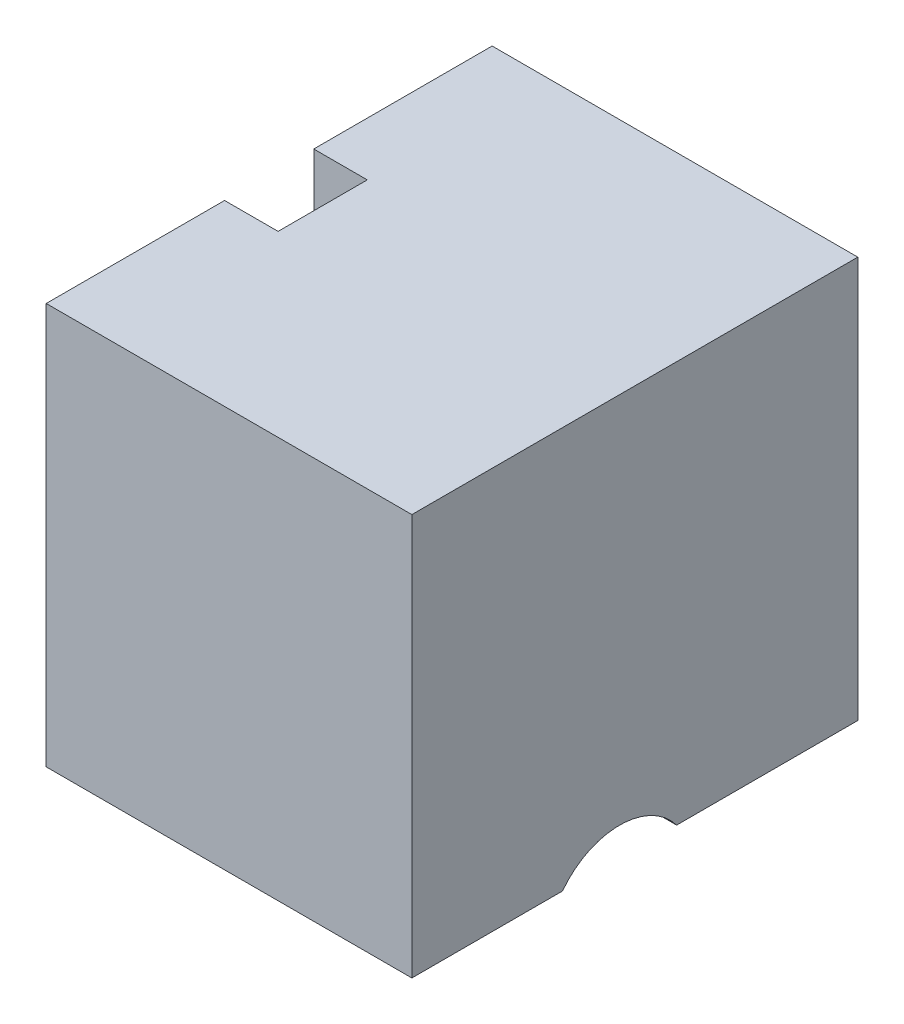
ISO-10303-21;
HEADER;
FILE_DESCRIPTION(('STEP AP214'),'2;1');
FILE_NAME('part.step','',(''),(''),'','','');
FILE_SCHEMA(('AUTOMOTIVE_DESIGN { 1 0 10303 214 1 1 1 1 }'));
ENDSEC;
DATA;
#1=APPLICATION_CONTEXT('core data for automotive mechanical design processes');
#2=APPLICATION_PROTOCOL_DEFINITION('international standard','automotive_design',2000,#1);
#3=PRODUCT_CONTEXT('',#1,'mechanical');
#4=PRODUCT('Part','Part','',(#3));
#5=PRODUCT_RELATED_PRODUCT_CATEGORY('part','',(#4));
#6=PRODUCT_DEFINITION_FORMATION('','',#4);
#7=PRODUCT_DEFINITION_CONTEXT('part definition',#1,'design');
#8=PRODUCT_DEFINITION('design','',#6,#7);
#9=PRODUCT_DEFINITION_SHAPE('','',#8);
#10=(LENGTH_UNIT() NAMED_UNIT(*) SI_UNIT(.MILLI.,.METRE.));
#11=(NAMED_UNIT(*) PLANE_ANGLE_UNIT() SI_UNIT($,.RADIAN.));
#12=(NAMED_UNIT(*) SI_UNIT($,.STERADIAN.) SOLID_ANGLE_UNIT());
#13=UNCERTAINTY_MEASURE_WITH_UNIT(LENGTH_MEASURE(1.E-05),#10,'distance_accuracy_value','');
#14=(GEOMETRIC_REPRESENTATION_CONTEXT(3) GLOBAL_UNCERTAINTY_ASSIGNED_CONTEXT((#13)) GLOBAL_UNIT_ASSIGNED_CONTEXT((#10,
#11,#12)) REPRESENTATION_CONTEXT('',''));
#15=CARTESIAN_POINT('',(0.,0.,0.));
#16=DIRECTION('',(0.,0.,1.));
#17=DIRECTION('',(1.,0.,0.));
#18=AXIS2_PLACEMENT_3D('',#15,#16,#17);
#19=CARTESIAN_POINT('',(0.,0.,0.));
#20=DIRECTION('',(0.,1.,0.));
#21=DIRECTION('',(0.,0.,1.));
#22=AXIS2_PLACEMENT_3D('',#19,#20,#21);
#23=PLANE('',#22);
#24=DIRECTION('',(0.,0.,1.));
#25=VECTOR('',#24,1.);
#26=CARTESIAN_POINT('',(-14.0665097118802,0.,23.2914057311783));
#27=LINE('',#26,#25);
#28=CARTESIAN_POINT('',(-14.0665097118802,0.,6.39655623678999));
#29=VERTEX_POINT('',#28);
#30=CARTESIAN_POINT('',(-14.0665097118802,0.,23.2914057311783));
#31=VERTEX_POINT('',#30);
#32=EDGE_CURVE('E183',#29,#31,#27,.T.);
#33=ORIENTED_EDGE('',*,*,#32,.F.);
#34=DIRECTION('',(1.,0.,0.));
#35=VECTOR('',#34,1.);
#36=CARTESIAN_POINT('',(-14.0665097118802,0.,6.39655623678999));
#37=LINE('',#36,#35);
#38=CARTESIAN_POINT('',(26.9334902881198,0.,6.39655623678999));
#39=VERTEX_POINT('',#38);
#40=EDGE_CURVE('E11',#29,#39,#37,.T.);
#41=ORIENTED_EDGE('',*,*,#40,.T.);
#42=DIRECTION('',(0.,0.,-1.));
#43=VECTOR('',#42,1.);
#44=CARTESIAN_POINT('',(26.9334902881198,0.,-26.7085942688217));
#45=LINE('',#44,#43);
#46=CARTESIAN_POINT('',(26.9334902881198,0.,23.2914057311783));
#47=VERTEX_POINT('',#46);
#48=EDGE_CURVE('E130',#47,#39,#45,.T.);
#49=ORIENTED_EDGE('',*,*,#48,.F.);
#50=DIRECTION('',(1.,0.,0.));
#51=VECTOR('',#50,1.);
#52=CARTESIAN_POINT('',(26.9334902881198,0.,23.2914057311783));
#53=LINE('',#52,#51);
#54=EDGE_CURVE('E135',#31,#47,#53,.T.);
#55=ORIENTED_EDGE('',*,*,#54,.F.);
#56=EDGE_LOOP('',(#33,#41,#49,#55));
#57=FACE_BOUND('',#56,.T.);
#58=ADVANCED_FACE('F39',(#57),#23,.F.);
#59=CARTESIAN_POINT('',(-14.0665097118802,45.,23.2914057311783));
#60=DIRECTION('',(1.,0.,0.));
#61=DIRECTION('',(0.,0.,-1.));
#62=AXIS2_PLACEMENT_3D('',#59,#60,#61);
#63=PLANE('',#62);
#64=CARTESIAN_POINT('',(-14.0665097118802,0.,-26.7085942688217));
#65=VERTEX_POINT('',#64);
#66=CARTESIAN_POINT('',(-14.0665097118802,0.,-6.39655623678999));
#67=VERTEX_POINT('',#66);
#68=EDGE_CURVE('E137',#65,#67,#27,.T.);
#69=ORIENTED_EDGE('',*,*,#68,.T.);
#70=CARTESIAN_POINT('',(-14.0665097118802,-4.8045882559886,0.));
#71=DIRECTION('',(1.,0.,0.));
#72=DIRECTION('',(0.,0.,-1.));
#73=AXIS2_PLACEMENT_3D('',#70,#71,#72);
#74=CIRCLE('',#73,8.00000000000004);
#75=EDGE_CURVE('E54',#67,#29,#74,.T.);
#76=ORIENTED_EDGE('',*,*,#75,.T.);
#77=ORIENTED_EDGE('',*,*,#32,.T.);
#78=DIRECTION('',(0.,-1.,0.));
#79=VECTOR('',#78,1.);
#80=CARTESIAN_POINT('',(-14.0665097118802,45.,23.2914057311783));
#81=LINE('',#80,#79);
#82=CARTESIAN_POINT('',(-14.0665097118802,45.,23.2914057311783));
#83=VERTEX_POINT('',#82);
#84=EDGE_CURVE('E151',#83,#31,#81,.T.);
#85=ORIENTED_EDGE('',*,*,#84,.F.);
#86=DIRECTION('',(0.,0.,1.));
#87=VECTOR('',#86,1.);
#88=CARTESIAN_POINT('',(-14.0665097118802,45.,23.2914057311783));
#89=LINE('',#88,#87);
#90=CARTESIAN_POINT('',(-14.0665097118802,45.,3.29140573117831));
#91=VERTEX_POINT('',#90);
#92=EDGE_CURVE('E142',#91,#83,#89,.T.);
#93=ORIENTED_EDGE('',*,*,#92,.F.);
#94=DIRECTION('',(0.,1.,0.));
#95=VECTOR('',#94,1.);
#96=CARTESIAN_POINT('',(-14.0665097118802,45.,3.29140573117831));
#97=LINE('',#96,#95);
#98=CARTESIAN_POINT('',(-14.0665097118802,35.,3.29140573117831));
#99=VERTEX_POINT('',#98);
#100=EDGE_CURVE('E62',#99,#91,#97,.T.);
#101=ORIENTED_EDGE('',*,*,#100,.F.);
#102=DIRECTION('',(0.,0.,1.));
#103=VECTOR('',#102,1.);
#104=CARTESIAN_POINT('',(-14.0665097118802,35.,23.2914057311783));
#105=LINE('',#104,#103);
#106=CARTESIAN_POINT('',(-14.0665097118802,35.,-6.70859426882169));
#107=VERTEX_POINT('',#106);
#108=EDGE_CURVE('E121',#107,#99,#105,.T.);
#109=ORIENTED_EDGE('',*,*,#108,.F.);
#110=DIRECTION('',(0.,-1.,0.));
#111=VECTOR('',#110,1.);
#112=CARTESIAN_POINT('',(-14.0665097118802,45.,-6.70859426882169));
#113=LINE('',#112,#111);
#114=CARTESIAN_POINT('',(-14.0665097118802,45.,-6.70859426882169));
#115=VERTEX_POINT('',#114);
#116=EDGE_CURVE('E180',#115,#107,#113,.T.);
#117=ORIENTED_EDGE('',*,*,#116,.F.);
#118=CARTESIAN_POINT('',(-14.0665097118802,45.,-26.7085942688217));
#119=VERTEX_POINT('',#118);
#120=EDGE_CURVE('E188',#119,#115,#89,.T.);
#121=ORIENTED_EDGE('',*,*,#120,.F.);
#122=DIRECTION('',(0.,-1.,0.));
#123=VECTOR('',#122,1.);
#124=CARTESIAN_POINT('',(-14.0665097118802,45.,-26.7085942688217));
#125=LINE('',#124,#123);
#126=EDGE_CURVE('E143',#119,#65,#125,.T.);
#127=ORIENTED_EDGE('',*,*,#126,.T.);
#128=EDGE_LOOP('',(#69,#76,#77,#85,#93,#101,#109,#117,#121,#127));
#129=FACE_BOUND('',#128,.T.);
#130=ADVANCED_FACE('F41',(#129),#63,.F.);
#131=CARTESIAN_POINT('',(0.,45.,0.));
#132=DIRECTION('',(0.,1.,0.));
#133=DIRECTION('',(0.,0.,1.));
#134=AXIS2_PLACEMENT_3D('',#131,#132,#133);
#135=PLANE('',#134);
#136=ORIENTED_EDGE('',*,*,#120,.T.);
#137=DIRECTION('',(1.,0.,0.));
#138=VECTOR('',#137,1.);
#139=CARTESIAN_POINT('',(0.,45.,-6.70859426882169));
#140=LINE('',#139,#138);
#141=CARTESIAN_POINT('',(-8.06650971188017,45.,-6.70859426882169));
#142=VERTEX_POINT('',#141);
#143=EDGE_CURVE('E159',#115,#142,#140,.T.);
#144=ORIENTED_EDGE('',*,*,#143,.T.);
#145=DIRECTION('',(0.,0.,1.));
#146=VECTOR('',#145,1.);
#147=CARTESIAN_POINT('',(-8.06650971188017,45.,0.));
#148=LINE('',#147,#146);
#149=CARTESIAN_POINT('',(-8.06650971188017,45.,3.29140573117831));
#150=VERTEX_POINT('',#149);
#151=EDGE_CURVE('E156',#142,#150,#148,.T.);
#152=ORIENTED_EDGE('',*,*,#151,.T.);
#153=DIRECTION('',(-1.,0.,0.));
#154=VECTOR('',#153,1.);
#155=CARTESIAN_POINT('',(0.,45.,3.29140573117831));
#156=LINE('',#155,#154);
#157=EDGE_CURVE('E154',#150,#91,#156,.T.);
#158=ORIENTED_EDGE('',*,*,#157,.T.);
#159=ORIENTED_EDGE('',*,*,#92,.T.);
#160=DIRECTION('',(1.,0.,0.));
#161=VECTOR('',#160,1.);
#162=CARTESIAN_POINT('',(26.9334902881198,45.,23.2914057311783));
#163=LINE('',#162,#161);
#164=CARTESIAN_POINT('',(26.9334902881198,45.,23.2914057311783));
#165=VERTEX_POINT('',#164);
#166=EDGE_CURVE('E191',#83,#165,#163,.T.);
#167=ORIENTED_EDGE('',*,*,#166,.T.);
#168=DIRECTION('',(0.,0.,-1.));
#169=VECTOR('',#168,1.);
#170=CARTESIAN_POINT('',(26.9334902881198,45.,-26.7085942688217));
#171=LINE('',#170,#169);
#172=CARTESIAN_POINT('',(26.9334902881198,45.,-26.7085942688217));
#173=VERTEX_POINT('',#172);
#174=EDGE_CURVE('E193',#165,#173,#171,.T.);
#175=ORIENTED_EDGE('',*,*,#174,.T.);
#176=DIRECTION('',(-1.,0.,0.));
#177=VECTOR('',#176,1.);
#178=CARTESIAN_POINT('',(26.9334902881198,45.,-26.7085942688217));
#179=LINE('',#178,#177);
#180=EDGE_CURVE('E147',#173,#119,#179,.T.);
#181=ORIENTED_EDGE('',*,*,#180,.T.);
#182=EDGE_LOOP('',(#136,#144,#152,#158,#159,#167,#175,#181));
#183=FACE_BOUND('',#182,.T.);
#184=ADVANCED_FACE('F204',(#183),#135,.T.);
#185=CARTESIAN_POINT('',(26.9334902881198,45.,23.2914057311783));
#186=DIRECTION('',(0.,0.,-1.));
#187=DIRECTION('',(-1.,0.,0.));
#188=AXIS2_PLACEMENT_3D('',#185,#186,#187);
#189=PLANE('',#188);
#190=ORIENTED_EDGE('',*,*,#54,.T.);
#191=DIRECTION('',(0.,-1.,0.));
#192=VECTOR('',#191,1.);
#193=CARTESIAN_POINT('',(26.9334902881198,45.,23.2914057311783));
#194=LINE('',#193,#192);
#195=EDGE_CURVE('E149',#165,#47,#194,.T.);
#196=ORIENTED_EDGE('',*,*,#195,.F.);
#197=ORIENTED_EDGE('',*,*,#166,.F.);
#198=ORIENTED_EDGE('',*,*,#84,.T.);
#199=EDGE_LOOP('',(#190,#196,#197,#198));
#200=FACE_BOUND('',#199,.T.);
#201=ADVANCED_FACE('F201',(#200),#189,.F.);
#202=CARTESIAN_POINT('',(26.9334902881198,45.,-26.7085942688217));
#203=DIRECTION('',(-1.,0.,0.));
#204=DIRECTION('',(0.,0.,1.));
#205=AXIS2_PLACEMENT_3D('',#202,#203,#204);
#206=PLANE('',#205);
#207=ORIENTED_EDGE('',*,*,#48,.T.);
#208=CARTESIAN_POINT('',(26.9334902881198,-4.8045882559886,0.));
#209=DIRECTION('',(1.,0.,0.));
#210=DIRECTION('',(0.,0.,-1.));
#211=AXIS2_PLACEMENT_3D('',#208,#209,#210);
#212=CIRCLE('',#211,8.00000000000004);
#213=CARTESIAN_POINT('',(26.9334902881198,0.,-6.39655623679));
#214=VERTEX_POINT('',#213);
#215=EDGE_CURVE('E116',#214,#39,#212,.T.);
#216=ORIENTED_EDGE('',*,*,#215,.F.);
#217=CARTESIAN_POINT('',(26.9334902881198,0.,-26.7085942688217));
#218=VERTEX_POINT('',#217);
#219=EDGE_CURVE('E126',#214,#218,#45,.T.);
#220=ORIENTED_EDGE('',*,*,#219,.T.);
#221=DIRECTION('',(0.,-1.,0.));
#222=VECTOR('',#221,1.);
#223=CARTESIAN_POINT('',(26.9334902881198,45.,-26.7085942688217));
#224=LINE('',#223,#222);
#225=EDGE_CURVE('E146',#173,#218,#224,.T.);
#226=ORIENTED_EDGE('',*,*,#225,.F.);
#227=ORIENTED_EDGE('',*,*,#174,.F.);
#228=ORIENTED_EDGE('',*,*,#195,.T.);
#229=EDGE_LOOP('',(#207,#216,#220,#226,#227,#228));
#230=FACE_BOUND('',#229,.T.);
#231=ADVANCED_FACE('F124',(#230),#206,.F.);
#232=CARTESIAN_POINT('',(26.9334902881198,45.,-26.7085942688217));
#233=DIRECTION('',(0.,0.,1.));
#234=DIRECTION('',(1.,0.,0.));
#235=AXIS2_PLACEMENT_3D('',#232,#233,#234);
#236=PLANE('',#235);
#237=DIRECTION('',(-1.,0.,0.));
#238=VECTOR('',#237,1.);
#239=CARTESIAN_POINT('',(26.9334902881198,0.,-26.7085942688217));
#240=LINE('',#239,#238);
#241=EDGE_CURVE('E134',#218,#65,#240,.T.);
#242=ORIENTED_EDGE('',*,*,#241,.T.);
#243=ORIENTED_EDGE('',*,*,#126,.F.);
#244=ORIENTED_EDGE('',*,*,#180,.F.);
#245=ORIENTED_EDGE('',*,*,#225,.T.);
#246=EDGE_LOOP('',(#242,#243,#244,#245));
#247=FACE_BOUND('',#246,.T.);
#248=ADVANCED_FACE('F218',(#247),#236,.F.);
#249=ORIENTED_EDGE('',*,*,#219,.F.);
#250=DIRECTION('',(1.,0.,0.));
#251=VECTOR('',#250,1.);
#252=CARTESIAN_POINT('',(-14.0665097118802,0.,-6.39655623678999));
#253=LINE('',#252,#251);
#254=EDGE_CURVE('E47',#214,#67,#253,.F.);
#255=ORIENTED_EDGE('',*,*,#254,.T.);
#256=ORIENTED_EDGE('',*,*,#68,.F.);
#257=ORIENTED_EDGE('',*,*,#241,.F.);
#258=EDGE_LOOP('',(#249,#255,#256,#257));
#259=FACE_BOUND('',#258,.T.);
#260=ADVANCED_FACE('F133',(#259),#23,.F.);
#261=CARTESIAN_POINT('',(0.,35.,0.));
#262=DIRECTION('',(0.,1.,0.));
#263=DIRECTION('',(0.,0.,1.));
#264=AXIS2_PLACEMENT_3D('',#261,#262,#263);
#265=PLANE('',#264);
#266=ORIENTED_EDGE('',*,*,#108,.T.);
#267=DIRECTION('',(1.,0.,0.));
#268=VECTOR('',#267,1.);
#269=CARTESIAN_POINT('',(-20.0665097118802,35.,3.29140573117831));
#270=LINE('',#269,#268);
#271=CARTESIAN_POINT('',(-8.06650971188017,35.,3.29140573117831));
#272=VERTEX_POINT('',#271);
#273=EDGE_CURVE('E168',#99,#272,#270,.T.);
#274=ORIENTED_EDGE('',*,*,#273,.T.);
#275=DIRECTION('',(0.,0.,-1.));
#276=VECTOR('',#275,1.);
#277=CARTESIAN_POINT('',(-8.06650971188017,35.,-6.70859426882169));
#278=LINE('',#277,#276);
#279=CARTESIAN_POINT('',(-8.06650971188017,35.,-6.70859426882169));
#280=VERTEX_POINT('',#279);
#281=EDGE_CURVE('E208',#272,#280,#278,.T.);
#282=ORIENTED_EDGE('',*,*,#281,.T.);
#283=DIRECTION('',(-1.,0.,0.));
#284=VECTOR('',#283,1.);
#285=CARTESIAN_POINT('',(-20.0665097118802,35.,-6.70859426882169));
#286=LINE('',#285,#284);
#287=EDGE_CURVE('E171',#280,#107,#286,.T.);
#288=ORIENTED_EDGE('',*,*,#287,.T.);
#289=EDGE_LOOP('',(#266,#274,#282,#288));
#290=FACE_BOUND('',#289,.T.);
#291=ADVANCED_FACE('F166',(#290),#265,.T.);
#292=CARTESIAN_POINT('',(-20.0665097118802,45.000012,-6.70859426882169));
#293=DIRECTION('',(0.,0.,1.));
#294=DIRECTION('',(1.,0.,0.));
#295=AXIS2_PLACEMENT_3D('',#292,#293,#294);
#296=PLANE('',#295);
#297=ORIENTED_EDGE('',*,*,#116,.T.);
#298=ORIENTED_EDGE('',*,*,#287,.F.);
#299=DIRECTION('',(0.,-1.,0.));
#300=VECTOR('',#299,1.);
#301=CARTESIAN_POINT('',(-8.06650971188017,45.000012,-6.70859426882169));
#302=LINE('',#301,#300);
#303=EDGE_CURVE('E181',#142,#280,#302,.T.);
#304=ORIENTED_EDGE('',*,*,#303,.F.);
#305=ORIENTED_EDGE('',*,*,#143,.F.);
#306=EDGE_LOOP('',(#297,#298,#304,#305));
#307=FACE_BOUND('',#306,.T.);
#308=ADVANCED_FACE('F213',(#307),#296,.T.);
#309=CARTESIAN_POINT('',(-20.0665097118802,45.000012,3.29140573117831));
#310=DIRECTION('',(0.,0.,-1.));
#311=DIRECTION('',(-1.,0.,0.));
#312=AXIS2_PLACEMENT_3D('',#309,#310,#311);
#313=PLANE('',#312);
#314=ORIENTED_EDGE('',*,*,#100,.T.);
#315=ORIENTED_EDGE('',*,*,#157,.F.);
#316=DIRECTION('',(0.,-1.,0.));
#317=VECTOR('',#316,1.);
#318=CARTESIAN_POINT('',(-8.06650971188017,45.000012,3.29140573117831));
#319=LINE('',#318,#317);
#320=EDGE_CURVE('E176',#150,#272,#319,.T.);
#321=ORIENTED_EDGE('',*,*,#320,.T.);
#322=ORIENTED_EDGE('',*,*,#273,.F.);
#323=EDGE_LOOP('',(#314,#315,#321,#322));
#324=FACE_BOUND('',#323,.T.);
#325=ADVANCED_FACE('F174',(#324),#313,.T.);
#326=CARTESIAN_POINT('',(-8.06650971188017,45.000012,-6.70859426882169));
#327=DIRECTION('',(-1.,0.,0.));
#328=DIRECTION('',(0.,0.,1.));
#329=AXIS2_PLACEMENT_3D('',#326,#327,#328);
#330=PLANE('',#329);
#331=ORIENTED_EDGE('',*,*,#303,.T.);
#332=ORIENTED_EDGE('',*,*,#281,.F.);
#333=ORIENTED_EDGE('',*,*,#320,.F.);
#334=ORIENTED_EDGE('',*,*,#151,.F.);
#335=EDGE_LOOP('',(#331,#332,#333,#334));
#336=FACE_BOUND('',#335,.T.);
#337=ADVANCED_FACE('F206',(#336),#330,.T.);
#338=CARTESIAN_POINT('',(-14.0665097118802,-4.8045882559886,0.));
#339=DIRECTION('',(1.,0.,0.));
#340=DIRECTION('',(0.,0.,-1.));
#341=AXIS2_PLACEMENT_3D('',#338,#339,#340);
#342=CYLINDRICAL_SURFACE('',#341,8.00000000000004);
#343=ORIENTED_EDGE('',*,*,#75,.F.);
#344=ORIENTED_EDGE('',*,*,#254,.F.);
#345=ORIENTED_EDGE('',*,*,#215,.T.);
#346=ORIENTED_EDGE('',*,*,#40,.F.);
#347=EDGE_LOOP('',(#343,#344,#345,#346));
#348=FACE_BOUND('',#347,.T.);
#349=ADVANCED_FACE('F115',(#348),#342,.F.);
#350=CLOSED_SHELL('',(#58,#130,#184,#201,#231,#248,#260,#291,#308,#325,#337,#349));
#351=MANIFOLD_SOLID_BREP('B2',#350);
#352=ADVANCED_BREP_SHAPE_REPRESENTATION('',(#18,#351),#14);
#353=SHAPE_DEFINITION_REPRESENTATION(#9,#352);
ENDSEC;
END-ISO-10303-21;
